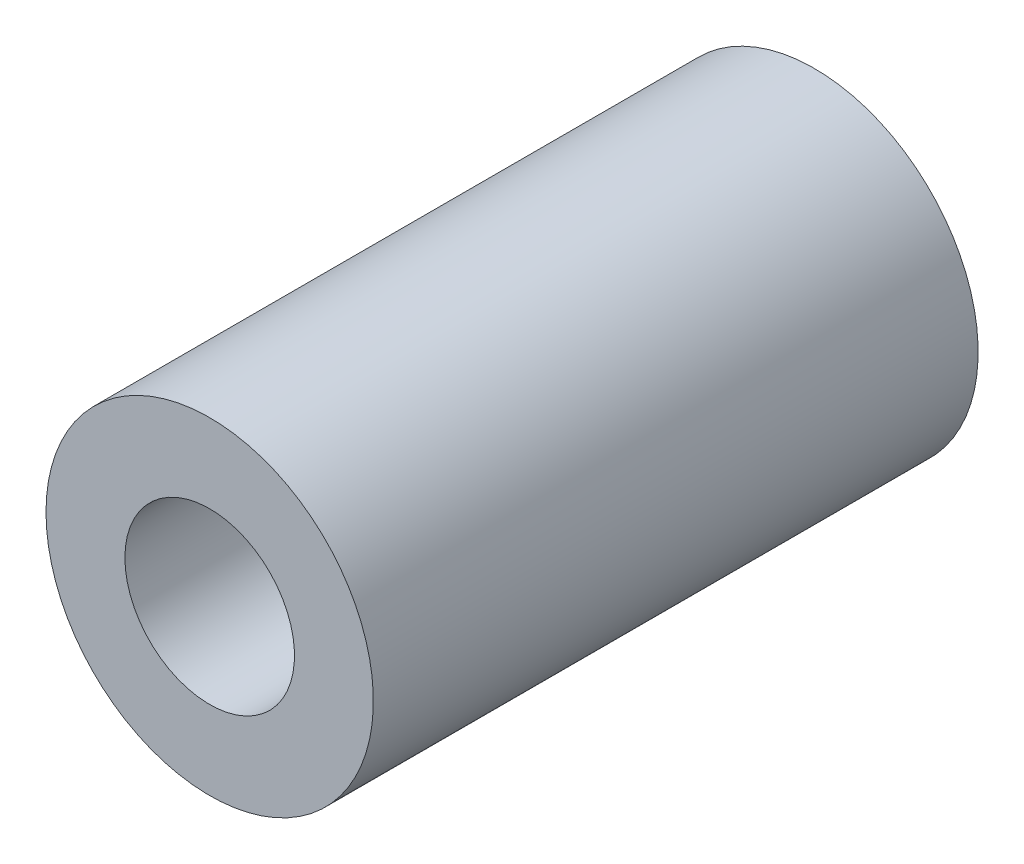
ISO-10303-21;
HEADER;
FILE_DESCRIPTION(('STEP AP214'),'2;1');
FILE_NAME('part.step','',(''),(''),'','','');
FILE_SCHEMA(('AUTOMOTIVE_DESIGN { 1 0 10303 214 1 1 1 1 }'));
ENDSEC;
DATA;
#1=APPLICATION_CONTEXT('core data for automotive mechanical design processes');
#2=APPLICATION_PROTOCOL_DEFINITION('international standard','automotive_design',2000,#1);
#3=PRODUCT_CONTEXT('',#1,'mechanical');
#4=PRODUCT('Part','Part','',(#3));
#5=PRODUCT_RELATED_PRODUCT_CATEGORY('part','',(#4));
#6=PRODUCT_DEFINITION_FORMATION('','',#4);
#7=PRODUCT_DEFINITION_CONTEXT('part definition',#1,'design');
#8=PRODUCT_DEFINITION('design','',#6,#7);
#9=PRODUCT_DEFINITION_SHAPE('','',#8);
#10=(LENGTH_UNIT() NAMED_UNIT(*) SI_UNIT(.MILLI.,.METRE.));
#11=(NAMED_UNIT(*) PLANE_ANGLE_UNIT() SI_UNIT($,.RADIAN.));
#12=(NAMED_UNIT(*) SI_UNIT($,.STERADIAN.) SOLID_ANGLE_UNIT());
#13=UNCERTAINTY_MEASURE_WITH_UNIT(LENGTH_MEASURE(1.E-05),#10,'distance_accuracy_value','');
#14=(GEOMETRIC_REPRESENTATION_CONTEXT(3) GLOBAL_UNCERTAINTY_ASSIGNED_CONTEXT((#13)) GLOBAL_UNIT_ASSIGNED_CONTEXT((#10,
#11,#12)) REPRESENTATION_CONTEXT('',''));
#15=CARTESIAN_POINT('',(0.,0.,0.));
#16=DIRECTION('',(0.,0.,1.));
#17=DIRECTION('',(1.,0.,0.));
#18=AXIS2_PLACEMENT_3D('',#15,#16,#17);
#19=CARTESIAN_POINT('',(0.,0.,11.684));
#20=DIRECTION('',(0.,0.,-1.));
#21=DIRECTION('',(-1.,0.,0.));
#22=AXIS2_PLACEMENT_3D('',#19,#20,#21);
#23=CYLINDRICAL_SURFACE('',#22,3.2766);
#24=CARTESIAN_POINT('',(0.,0.,-11.684));
#25=DIRECTION('',(0.,0.,-1.));
#26=DIRECTION('',(-1.,0.,0.));
#27=AXIS2_PLACEMENT_3D('',#24,#25,#26);
#28=CIRCLE('',#27,3.2766);
#29=CARTESIAN_POINT('',(-3.2766,0.,-11.684));
#30=VERTEX_POINT('',#29);
#31=EDGE_CURVE('E27',#30,#30,#28,.T.);
#32=ORIENTED_EDGE('',*,*,#31,.T.);
#33=EDGE_LOOP('',(#32));
#34=FACE_BOUND('',#33,.T.);
#35=CARTESIAN_POINT('',(0.,0.,11.684));
#36=DIRECTION('',(0.,0.,-1.));
#37=DIRECTION('',(-1.,0.,0.));
#38=AXIS2_PLACEMENT_3D('',#35,#36,#37);
#39=CIRCLE('',#38,3.2766);
#40=CARTESIAN_POINT('',(-3.2766,0.,11.684));
#41=VERTEX_POINT('',#40);
#42=EDGE_CURVE('E18',#41,#41,#39,.T.);
#43=ORIENTED_EDGE('',*,*,#42,.F.);
#44=EDGE_LOOP('',(#43));
#45=FACE_BOUND('',#44,.T.);
#46=ADVANCED_FACE('F15',(#34,#45),#23,.F.);
#47=CARTESIAN_POINT('',(0.,0.,11.684));
#48=DIRECTION('',(0.,0.,1.));
#49=DIRECTION('',(1.,0.,0.));
#50=AXIS2_PLACEMENT_3D('',#47,#48,#49);
#51=PLANE('',#50);
#52=ORIENTED_EDGE('',*,*,#42,.T.);
#53=EDGE_LOOP('',(#52));
#54=FACE_BOUND('',#53,.T.);
#55=CARTESIAN_POINT('',(0.,0.,11.684));
#56=DIRECTION('',(0.,0.,-1.));
#57=DIRECTION('',(-1.,0.,0.));
#58=AXIS2_PLACEMENT_3D('',#55,#56,#57);
#59=CIRCLE('',#58,6.3246);
#60=CARTESIAN_POINT('',(-6.3246,0.,11.684));
#61=VERTEX_POINT('',#60);
#62=EDGE_CURVE('E22',#61,#61,#59,.T.);
#63=ORIENTED_EDGE('',*,*,#62,.F.);
#64=EDGE_LOOP('',(#63));
#65=FACE_BOUND('',#64,.T.);
#66=ADVANCED_FACE('F35',(#54,#65),#51,.T.);
#67=CARTESIAN_POINT('',(0.,0.,-11.684));
#68=DIRECTION('',(0.,0.,1.));
#69=DIRECTION('',(1.,0.,0.));
#70=AXIS2_PLACEMENT_3D('',#67,#68,#69);
#71=PLANE('',#70);
#72=ORIENTED_EDGE('',*,*,#31,.F.);
#73=EDGE_LOOP('',(#72));
#74=FACE_BOUND('',#73,.T.);
#75=CARTESIAN_POINT('',(0.,0.,-11.684));
#76=DIRECTION('',(0.,0.,-1.));
#77=DIRECTION('',(-1.,0.,0.));
#78=AXIS2_PLACEMENT_3D('',#75,#76,#77);
#79=CIRCLE('',#78,6.3246);
#80=CARTESIAN_POINT('',(-6.3246,0.,-11.684));
#81=VERTEX_POINT('',#80);
#82=EDGE_CURVE('E10',#81,#81,#79,.F.);
#83=ORIENTED_EDGE('',*,*,#82,.F.);
#84=EDGE_LOOP('',(#83));
#85=FACE_BOUND('',#84,.T.);
#86=ADVANCED_FACE('F43',(#74,#85),#71,.F.);
#87=CARTESIAN_POINT('',(0.,0.,11.684));
#88=DIRECTION('',(0.,0.,-1.));
#89=DIRECTION('',(-1.,0.,0.));
#90=AXIS2_PLACEMENT_3D('',#87,#88,#89);
#91=CYLINDRICAL_SURFACE('',#90,6.3246);
#92=ORIENTED_EDGE('',*,*,#82,.T.);
#93=EDGE_LOOP('',(#92));
#94=FACE_BOUND('',#93,.T.);
#95=ORIENTED_EDGE('',*,*,#62,.T.);
#96=EDGE_LOOP('',(#95));
#97=FACE_BOUND('',#96,.T.);
#98=ADVANCED_FACE('F44',(#94,#97),#91,.T.);
#99=CLOSED_SHELL('',(#46,#66,#86,#98));
#100=MANIFOLD_SOLID_BREP('B1',#99);
#101=ADVANCED_BREP_SHAPE_REPRESENTATION('',(#18,#100),#14);
#102=SHAPE_DEFINITION_REPRESENTATION(#9,#101);
ENDSEC;
END-ISO-10303-21;
